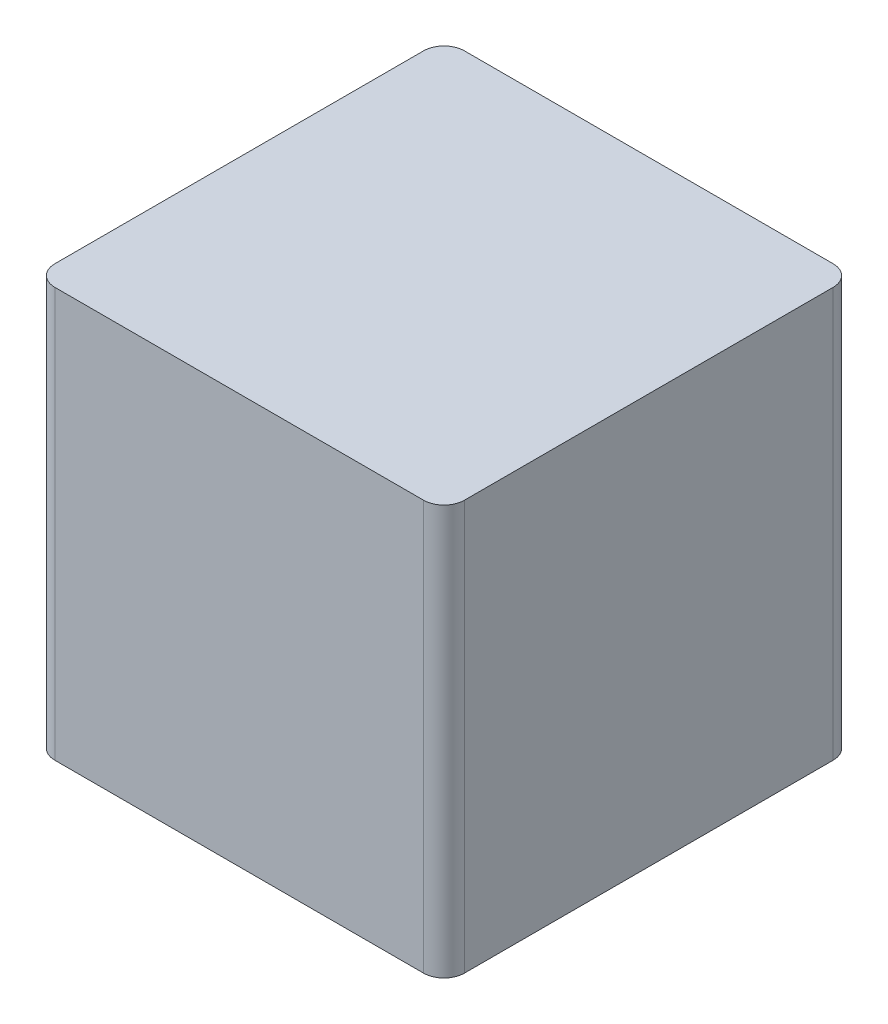
ISO-10303-21;
HEADER;
FILE_DESCRIPTION(('STEP AP214'),'2;1');
FILE_NAME('part.step','',(''),(''),'','','');
FILE_SCHEMA(('AUTOMOTIVE_DESIGN { 1 0 10303 214 1 1 1 1 }'));
ENDSEC;
DATA;
#1=APPLICATION_CONTEXT('core data for automotive mechanical design processes');
#2=APPLICATION_PROTOCOL_DEFINITION('international standard','automotive_design',2000,#1);
#3=PRODUCT_CONTEXT('',#1,'mechanical');
#4=PRODUCT('Part','Part','',(#3));
#5=PRODUCT_RELATED_PRODUCT_CATEGORY('part','',(#4));
#6=PRODUCT_DEFINITION_FORMATION('','',#4);
#7=PRODUCT_DEFINITION_CONTEXT('part definition',#1,'design');
#8=PRODUCT_DEFINITION('design','',#6,#7);
#9=PRODUCT_DEFINITION_SHAPE('','',#8);
#10=(LENGTH_UNIT() NAMED_UNIT(*) SI_UNIT(.MILLI.,.METRE.));
#11=(NAMED_UNIT(*) PLANE_ANGLE_UNIT() SI_UNIT($,.RADIAN.));
#12=(NAMED_UNIT(*) SI_UNIT($,.STERADIAN.) SOLID_ANGLE_UNIT());
#13=UNCERTAINTY_MEASURE_WITH_UNIT(LENGTH_MEASURE(1.E-05),#10,'distance_accuracy_value','');
#14=(GEOMETRIC_REPRESENTATION_CONTEXT(3) GLOBAL_UNCERTAINTY_ASSIGNED_CONTEXT((#13)) GLOBAL_UNIT_ASSIGNED_CONTEXT((#10,
#11,#12)) REPRESENTATION_CONTEXT('',''));
#15=CARTESIAN_POINT('',(0.,0.,0.));
#16=DIRECTION('',(0.,0.,1.));
#17=DIRECTION('',(1.,0.,0.));
#18=AXIS2_PLACEMENT_3D('',#15,#16,#17);
#19=CARTESIAN_POINT('',(10.,20.,10.));
#20=DIRECTION('',(-1.,0.,0.));
#21=DIRECTION('',(0.,0.,1.));
#22=AXIS2_PLACEMENT_3D('',#19,#20,#21);
#23=PLANE('',#22);
#24=DIRECTION('',(0.,0.,-1.));
#25=VECTOR('',#24,1.);
#26=CARTESIAN_POINT('',(10.,0.,10.));
#27=LINE('',#26,#25);
#28=CARTESIAN_POINT('',(10.,0.,9.));
#29=VERTEX_POINT('',#28);
#30=CARTESIAN_POINT('',(10.,0.,-9.));
#31=VERTEX_POINT('',#30);
#32=EDGE_CURVE('E129',#29,#31,#27,.T.);
#33=ORIENTED_EDGE('',*,*,#32,.T.);
#34=DIRECTION('',(0.,-1.,0.));
#35=VECTOR('',#34,1.);
#36=CARTESIAN_POINT('',(10.,20.,-9.));
#37=LINE('',#36,#35);
#38=CARTESIAN_POINT('',(10.,20.,-9.));
#39=VERTEX_POINT('',#38);
#40=EDGE_CURVE('E152',#31,#39,#37,.F.);
#41=ORIENTED_EDGE('',*,*,#40,.T.);
#42=DIRECTION('',(0.,0.,-1.));
#43=VECTOR('',#42,1.);
#44=CARTESIAN_POINT('',(10.,20.,10.));
#45=LINE('',#44,#43);
#46=CARTESIAN_POINT('',(10.,20.,9.));
#47=VERTEX_POINT('',#46);
#48=EDGE_CURVE('E127',#47,#39,#45,.T.);
#49=ORIENTED_EDGE('',*,*,#48,.F.);
#50=DIRECTION('',(0.,-1.,0.));
#51=VECTOR('',#50,1.);
#52=CARTESIAN_POINT('',(10.,20.,9.));
#53=LINE('',#52,#51);
#54=EDGE_CURVE('E149',#47,#29,#53,.T.);
#55=ORIENTED_EDGE('',*,*,#54,.T.);
#56=EDGE_LOOP('',(#33,#41,#49,#55));
#57=FACE_BOUND('',#56,.T.);
#58=ADVANCED_FACE('F34',(#57),#23,.F.);
#59=CARTESIAN_POINT('',(-10.,20.,-10.));
#60=DIRECTION('',(0.,0.,1.));
#61=DIRECTION('',(1.,0.,0.));
#62=AXIS2_PLACEMENT_3D('',#59,#60,#61);
#63=PLANE('',#62);
#64=DIRECTION('',(-1.,0.,0.));
#65=VECTOR('',#64,1.);
#66=CARTESIAN_POINT('',(-10.,0.,-10.));
#67=LINE('',#66,#65);
#68=CARTESIAN_POINT('',(9.,0.,-10.));
#69=VERTEX_POINT('',#68);
#70=CARTESIAN_POINT('',(-9.,0.,-10.));
#71=VERTEX_POINT('',#70);
#72=EDGE_CURVE('E125',#69,#71,#67,.T.);
#73=ORIENTED_EDGE('',*,*,#72,.T.);
#74=DIRECTION('',(0.,-1.,0.));
#75=VECTOR('',#74,1.);
#76=CARTESIAN_POINT('',(-9.,20.,-10.));
#77=LINE('',#76,#75);
#78=CARTESIAN_POINT('',(-9.,20.,-10.));
#79=VERTEX_POINT('',#78);
#80=EDGE_CURVE('E104',#71,#79,#77,.F.);
#81=ORIENTED_EDGE('',*,*,#80,.T.);
#82=DIRECTION('',(-1.,0.,0.));
#83=VECTOR('',#82,1.);
#84=CARTESIAN_POINT('',(-10.,20.,-10.));
#85=LINE('',#84,#83);
#86=CARTESIAN_POINT('',(9.,20.,-10.));
#87=VERTEX_POINT('',#86);
#88=EDGE_CURVE('E168',#87,#79,#85,.T.);
#89=ORIENTED_EDGE('',*,*,#88,.F.);
#90=DIRECTION('',(0.,-1.,0.));
#91=VECTOR('',#90,1.);
#92=CARTESIAN_POINT('',(9.,20.,-10.));
#93=LINE('',#92,#91);
#94=EDGE_CURVE('E109',#87,#69,#93,.T.);
#95=ORIENTED_EDGE('',*,*,#94,.T.);
#96=EDGE_LOOP('',(#73,#81,#89,#95));
#97=FACE_BOUND('',#96,.T.);
#98=ADVANCED_FACE('F185',(#97),#63,.F.);
#99=CARTESIAN_POINT('',(-10.,20.,10.));
#100=DIRECTION('',(1.,0.,0.));
#101=DIRECTION('',(0.,0.,-1.));
#102=AXIS2_PLACEMENT_3D('',#99,#100,#101);
#103=PLANE('',#102);
#104=DIRECTION('',(0.,0.,1.));
#105=VECTOR('',#104,1.);
#106=CARTESIAN_POINT('',(-10.,20.,10.));
#107=LINE('',#106,#105);
#108=CARTESIAN_POINT('',(-10.,20.,-9.));
#109=VERTEX_POINT('',#108);
#110=CARTESIAN_POINT('',(-10.,20.,9.));
#111=VERTEX_POINT('',#110);
#112=EDGE_CURVE('E118',#109,#111,#107,.T.);
#113=ORIENTED_EDGE('',*,*,#112,.F.);
#114=DIRECTION('',(0.,-1.,0.));
#115=VECTOR('',#114,1.);
#116=CARTESIAN_POINT('',(-10.,20.,-9.));
#117=LINE('',#116,#115);
#118=CARTESIAN_POINT('',(-10.,0.,-9.));
#119=VERTEX_POINT('',#118);
#120=EDGE_CURVE('E103',#109,#119,#117,.T.);
#121=ORIENTED_EDGE('',*,*,#120,.T.);
#122=DIRECTION('',(0.,0.,1.));
#123=VECTOR('',#122,1.);
#124=CARTESIAN_POINT('',(-10.,0.,10.));
#125=LINE('',#124,#123);
#126=CARTESIAN_POINT('',(-10.,0.,9.));
#127=VERTEX_POINT('',#126);
#128=EDGE_CURVE('E116',#119,#127,#125,.T.);
#129=ORIENTED_EDGE('',*,*,#128,.T.);
#130=DIRECTION('',(0.,-1.,0.));
#131=VECTOR('',#130,1.);
#132=CARTESIAN_POINT('',(-10.,20.,9.));
#133=LINE('',#132,#131);
#134=EDGE_CURVE('E120',#127,#111,#133,.F.);
#135=ORIENTED_EDGE('',*,*,#134,.T.);
#136=EDGE_LOOP('',(#113,#121,#129,#135));
#137=FACE_BOUND('',#136,.T.);
#138=ADVANCED_FACE('F115',(#137),#103,.F.);
#139=CARTESIAN_POINT('',(-10.,20.,10.));
#140=DIRECTION('',(0.,0.,-1.));
#141=DIRECTION('',(-1.,0.,0.));
#142=AXIS2_PLACEMENT_3D('',#139,#140,#141);
#143=PLANE('',#142);
#144=DIRECTION('',(1.,0.,0.));
#145=VECTOR('',#144,1.);
#146=CARTESIAN_POINT('',(-10.,0.,10.));
#147=LINE('',#146,#145);
#148=CARTESIAN_POINT('',(-9.,0.,10.));
#149=VERTEX_POINT('',#148);
#150=CARTESIAN_POINT('',(9.,0.,10.));
#151=VERTEX_POINT('',#150);
#152=EDGE_CURVE('E124',#149,#151,#147,.T.);
#153=ORIENTED_EDGE('',*,*,#152,.T.);
#154=DIRECTION('',(0.,-1.,0.));
#155=VECTOR('',#154,1.);
#156=CARTESIAN_POINT('',(9.,20.,10.));
#157=LINE('',#156,#155);
#158=CARTESIAN_POINT('',(9.,20.,10.));
#159=VERTEX_POINT('',#158);
#160=EDGE_CURVE('E11',#151,#159,#157,.F.);
#161=ORIENTED_EDGE('',*,*,#160,.T.);
#162=DIRECTION('',(1.,0.,0.));
#163=VECTOR('',#162,1.);
#164=CARTESIAN_POINT('',(-10.,20.,10.));
#165=LINE('',#164,#163);
#166=CARTESIAN_POINT('',(-9.,20.,10.));
#167=VERTEX_POINT('',#166);
#168=EDGE_CURVE('E133',#167,#159,#165,.T.);
#169=ORIENTED_EDGE('',*,*,#168,.F.);
#170=DIRECTION('',(0.,-1.,0.));
#171=VECTOR('',#170,1.);
#172=CARTESIAN_POINT('',(-9.,20.,10.));
#173=LINE('',#172,#171);
#174=EDGE_CURVE('E42',#167,#149,#173,.T.);
#175=ORIENTED_EDGE('',*,*,#174,.T.);
#176=EDGE_LOOP('',(#153,#161,#169,#175));
#177=FACE_BOUND('',#176,.T.);
#178=ADVANCED_FACE('F155',(#177),#143,.F.);
#179=CARTESIAN_POINT('',(0.,20.,0.));
#180=DIRECTION('',(0.,-1.,0.));
#181=DIRECTION('',(0.,0.,-1.));
#182=AXIS2_PLACEMENT_3D('',#179,#180,#181);
#183=PLANE('',#182);
#184=ORIENTED_EDGE('',*,*,#88,.T.);
#185=CARTESIAN_POINT('',(-9.,20.,-9.));
#186=DIRECTION('',(0.,-1.,0.));
#187=DIRECTION('',(0.,0.,-1.));
#188=AXIS2_PLACEMENT_3D('',#185,#186,#187);
#189=CIRCLE('',#188,1.);
#190=EDGE_CURVE('E147',#79,#109,#189,.F.);
#191=ORIENTED_EDGE('',*,*,#190,.T.);
#192=ORIENTED_EDGE('',*,*,#112,.T.);
#193=CARTESIAN_POINT('',(-9.,20.,9.));
#194=DIRECTION('',(0.,-1.,0.));
#195=DIRECTION('',(0.,0.,-1.));
#196=AXIS2_PLACEMENT_3D('',#193,#194,#195);
#197=CIRCLE('',#196,1.);
#198=EDGE_CURVE('E54',#111,#167,#197,.F.);
#199=ORIENTED_EDGE('',*,*,#198,.T.);
#200=ORIENTED_EDGE('',*,*,#168,.T.);
#201=CARTESIAN_POINT('',(9.,20.,9.));
#202=DIRECTION('',(0.,-1.,0.));
#203=DIRECTION('',(0.,0.,-1.));
#204=AXIS2_PLACEMENT_3D('',#201,#202,#203);
#205=CIRCLE('',#204,1.);
#206=EDGE_CURVE('E143',#159,#47,#205,.F.);
#207=ORIENTED_EDGE('',*,*,#206,.T.);
#208=ORIENTED_EDGE('',*,*,#48,.T.);
#209=CARTESIAN_POINT('',(9.,20.,-9.));
#210=DIRECTION('',(0.,-1.,0.));
#211=DIRECTION('',(0.,0.,-1.));
#212=AXIS2_PLACEMENT_3D('',#209,#210,#211);
#213=CIRCLE('',#212,1.);
#214=EDGE_CURVE('E145',#39,#87,#213,.F.);
#215=ORIENTED_EDGE('',*,*,#214,.T.);
#216=EDGE_LOOP('',(#184,#191,#192,#199,#200,#207,#208,#215));
#217=FACE_BOUND('',#216,.T.);
#218=ADVANCED_FACE('F174',(#217),#183,.F.);
#219=CARTESIAN_POINT('',(0.,0.,0.));
#220=DIRECTION('',(0.,-1.,0.));
#221=DIRECTION('',(0.,0.,-1.));
#222=AXIS2_PLACEMENT_3D('',#219,#220,#221);
#223=PLANE('',#222);
#224=ORIENTED_EDGE('',*,*,#128,.F.);
#225=CARTESIAN_POINT('',(-9.,0.,-9.));
#226=DIRECTION('',(0.,-1.,0.));
#227=DIRECTION('',(0.,0.,-1.));
#228=AXIS2_PLACEMENT_3D('',#225,#226,#227);
#229=CIRCLE('',#228,1.);
#230=EDGE_CURVE('E99',#119,#71,#229,.T.);
#231=ORIENTED_EDGE('',*,*,#230,.T.);
#232=ORIENTED_EDGE('',*,*,#72,.F.);
#233=CARTESIAN_POINT('',(9.,0.,-9.));
#234=DIRECTION('',(0.,-1.,0.));
#235=DIRECTION('',(0.,0.,-1.));
#236=AXIS2_PLACEMENT_3D('',#233,#234,#235);
#237=CIRCLE('',#236,1.);
#238=EDGE_CURVE('E110',#69,#31,#237,.T.);
#239=ORIENTED_EDGE('',*,*,#238,.T.);
#240=ORIENTED_EDGE('',*,*,#32,.F.);
#241=CARTESIAN_POINT('',(9.,0.,9.));
#242=DIRECTION('',(0.,-1.,0.));
#243=DIRECTION('',(0.,0.,-1.));
#244=AXIS2_PLACEMENT_3D('',#241,#242,#243);
#245=CIRCLE('',#244,1.);
#246=EDGE_CURVE('E136',#29,#151,#245,.T.);
#247=ORIENTED_EDGE('',*,*,#246,.T.);
#248=ORIENTED_EDGE('',*,*,#152,.F.);
#249=CARTESIAN_POINT('',(-9.,0.,9.));
#250=DIRECTION('',(0.,-1.,0.));
#251=DIRECTION('',(0.,0.,-1.));
#252=AXIS2_PLACEMENT_3D('',#249,#250,#251);
#253=CIRCLE('',#252,1.);
#254=EDGE_CURVE('E119',#149,#127,#253,.T.);
#255=ORIENTED_EDGE('',*,*,#254,.T.);
#256=EDGE_LOOP('',(#224,#231,#232,#239,#240,#247,#248,#255));
#257=FACE_BOUND('',#256,.T.);
#258=ADVANCED_FACE('F122',(#257),#223,.T.);
#259=CARTESIAN_POINT('',(-9.,20.,-9.));
#260=DIRECTION('',(0.,-1.,0.));
#261=DIRECTION('',(0.,0.,-1.));
#262=AXIS2_PLACEMENT_3D('',#259,#260,#261);
#263=CYLINDRICAL_SURFACE('',#262,1.);
#264=ORIENTED_EDGE('',*,*,#190,.F.);
#265=ORIENTED_EDGE('',*,*,#80,.F.);
#266=ORIENTED_EDGE('',*,*,#230,.F.);
#267=ORIENTED_EDGE('',*,*,#120,.F.);
#268=EDGE_LOOP('',(#264,#265,#266,#267));
#269=FACE_BOUND('',#268,.T.);
#270=ADVANCED_FACE('F102',(#269),#263,.T.);
#271=CARTESIAN_POINT('',(9.,20.,-9.));
#272=DIRECTION('',(0.,-1.,0.));
#273=DIRECTION('',(0.,0.,-1.));
#274=AXIS2_PLACEMENT_3D('',#271,#272,#273);
#275=CYLINDRICAL_SURFACE('',#274,1.);
#276=ORIENTED_EDGE('',*,*,#214,.F.);
#277=ORIENTED_EDGE('',*,*,#40,.F.);
#278=ORIENTED_EDGE('',*,*,#238,.F.);
#279=ORIENTED_EDGE('',*,*,#94,.F.);
#280=EDGE_LOOP('',(#276,#277,#278,#279));
#281=FACE_BOUND('',#280,.T.);
#282=ADVANCED_FACE('F196',(#281),#275,.T.);
#283=CARTESIAN_POINT('',(9.,20.,9.));
#284=DIRECTION('',(0.,-1.,0.));
#285=DIRECTION('',(0.,0.,-1.));
#286=AXIS2_PLACEMENT_3D('',#283,#284,#285);
#287=CYLINDRICAL_SURFACE('',#286,1.);
#288=ORIENTED_EDGE('',*,*,#206,.F.);
#289=ORIENTED_EDGE('',*,*,#160,.F.);
#290=ORIENTED_EDGE('',*,*,#246,.F.);
#291=ORIENTED_EDGE('',*,*,#54,.F.);
#292=EDGE_LOOP('',(#288,#289,#290,#291));
#293=FACE_BOUND('',#292,.T.);
#294=ADVANCED_FACE('F162',(#293),#287,.T.);
#295=CARTESIAN_POINT('',(-9.,20.,9.));
#296=DIRECTION('',(0.,-1.,0.));
#297=DIRECTION('',(0.,0.,-1.));
#298=AXIS2_PLACEMENT_3D('',#295,#296,#297);
#299=CYLINDRICAL_SURFACE('',#298,1.);
#300=ORIENTED_EDGE('',*,*,#198,.F.);
#301=ORIENTED_EDGE('',*,*,#134,.F.);
#302=ORIENTED_EDGE('',*,*,#254,.F.);
#303=ORIENTED_EDGE('',*,*,#174,.F.);
#304=EDGE_LOOP('',(#300,#301,#302,#303));
#305=FACE_BOUND('',#304,.T.);
#306=ADVANCED_FACE('F36',(#305),#299,.T.);
#307=CLOSED_SHELL('',(#58,#98,#138,#178,#218,#258,#270,#282,#294,#306));
#308=MANIFOLD_SOLID_BREP('B2',#307);
#309=ADVANCED_BREP_SHAPE_REPRESENTATION('',(#18,#308),#14);
#310=SHAPE_DEFINITION_REPRESENTATION(#9,#309);
ENDSEC;
END-ISO-10303-21;
